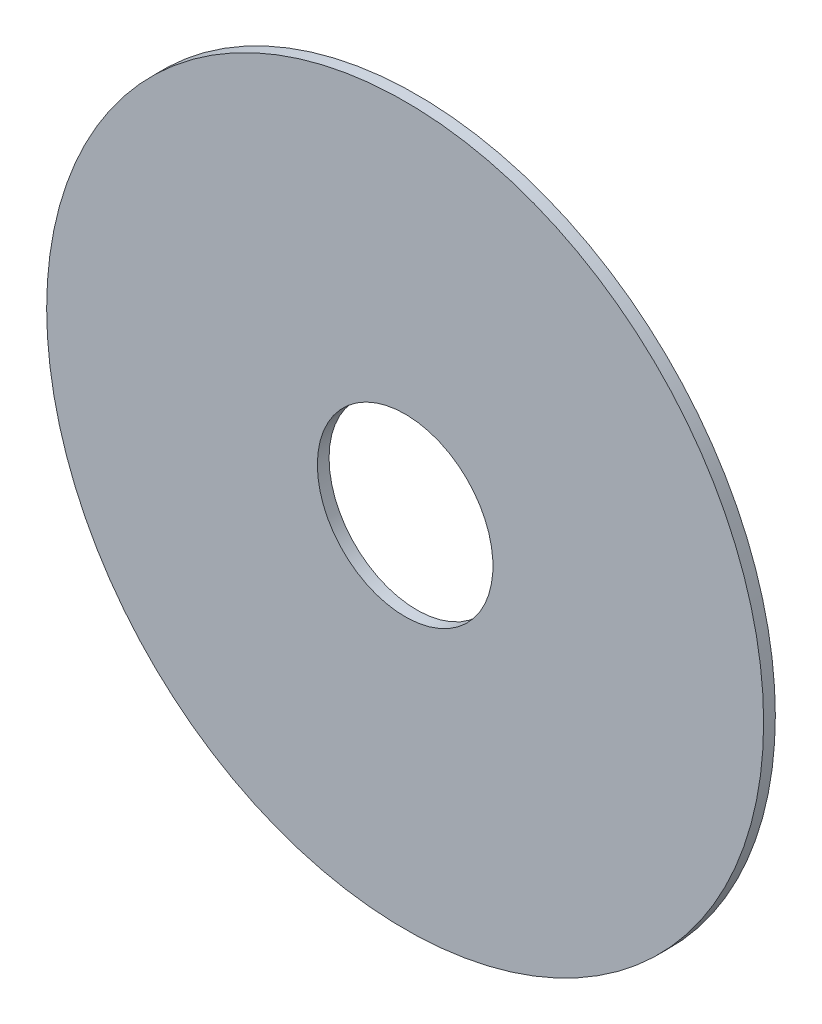
ISO-10303-21;
HEADER;
FILE_DESCRIPTION(('STEP AP214'),'2;1');
FILE_NAME('part.step','',(''),(''),'','','');
FILE_SCHEMA(('AUTOMOTIVE_DESIGN { 1 0 10303 214 1 1 1 1 }'));
ENDSEC;
DATA;
#1=APPLICATION_CONTEXT('core data for automotive mechanical design processes');
#2=APPLICATION_PROTOCOL_DEFINITION('international standard','automotive_design',2000,#1);
#3=PRODUCT_CONTEXT('',#1,'mechanical');
#4=PRODUCT('Part','Part','',(#3));
#5=PRODUCT_RELATED_PRODUCT_CATEGORY('part','',(#4));
#6=PRODUCT_DEFINITION_FORMATION('','',#4);
#7=PRODUCT_DEFINITION_CONTEXT('part definition',#1,'design');
#8=PRODUCT_DEFINITION('design','',#6,#7);
#9=PRODUCT_DEFINITION_SHAPE('','',#8);
#10=(LENGTH_UNIT() NAMED_UNIT(*) SI_UNIT(.MILLI.,.METRE.));
#11=(NAMED_UNIT(*) PLANE_ANGLE_UNIT() SI_UNIT($,.RADIAN.));
#12=(NAMED_UNIT(*) SI_UNIT($,.STERADIAN.) SOLID_ANGLE_UNIT());
#13=UNCERTAINTY_MEASURE_WITH_UNIT(LENGTH_MEASURE(1.E-05),#10,'distance_accuracy_value','');
#14=(GEOMETRIC_REPRESENTATION_CONTEXT(3) GLOBAL_UNCERTAINTY_ASSIGNED_CONTEXT((#13)) GLOBAL_UNIT_ASSIGNED_CONTEXT((#10,
#11,#12)) REPRESENTATION_CONTEXT('',''));
#15=CARTESIAN_POINT('',(0.,0.,0.));
#16=DIRECTION('',(0.,0.,1.));
#17=DIRECTION('',(1.,0.,0.));
#18=AXIS2_PLACEMENT_3D('',#15,#16,#17);
#19=CARTESIAN_POINT('',(0.,0.,0.));
#20=DIRECTION('',(0.,0.,1.));
#21=DIRECTION('',(1.,0.,0.));
#22=AXIS2_PLACEMENT_3D('',#19,#20,#21);
#23=PLANE('',#22);
#24=CARTESIAN_POINT('',(0.,0.,0.));
#25=DIRECTION('',(0.,0.,-1.));
#26=DIRECTION('',(1.,0.,0.));
#27=AXIS2_PLACEMENT_3D('',#24,#25,#26);
#28=CIRCLE('',#27,6.);
#29=CARTESIAN_POINT('',(-6.,0.,0.));
#30=VERTEX_POINT('',#29);
#31=EDGE_CURVE('E45',#30,#30,#28,.T.);
#32=ORIENTED_EDGE('',*,*,#31,.F.);
#33=EDGE_LOOP('',(#32));
#34=FACE_BOUND('',#33,.T.);
#35=CARTESIAN_POINT('',(0.,0.,0.));
#36=DIRECTION('',(0.,0.,1.));
#37=DIRECTION('',(1.,0.,0.));
#38=AXIS2_PLACEMENT_3D('',#35,#36,#37);
#39=CIRCLE('',#38,24.5);
#40=CARTESIAN_POINT('',(-24.5,0.,0.));
#41=VERTEX_POINT('',#40);
#42=EDGE_CURVE('E11',#41,#41,#39,.T.);
#43=ORIENTED_EDGE('',*,*,#42,.F.);
#44=EDGE_LOOP('',(#43));
#45=FACE_BOUND('',#44,.T.);
#46=ADVANCED_FACE('F17',(#34,#45),#23,.F.);
#47=CARTESIAN_POINT('',(0.,0.,0.8));
#48=DIRECTION('',(0.,0.,1.));
#49=DIRECTION('',(1.,0.,0.));
#50=AXIS2_PLACEMENT_3D('',#47,#48,#49);
#51=PLANE('',#50);
#52=CARTESIAN_POINT('',(0.,0.,0.8));
#53=DIRECTION('',(0.,0.,-1.));
#54=DIRECTION('',(1.,0.,0.));
#55=AXIS2_PLACEMENT_3D('',#52,#53,#54);
#56=CIRCLE('',#55,6.);
#57=CARTESIAN_POINT('',(-6.,0.,0.8));
#58=VERTEX_POINT('',#57);
#59=EDGE_CURVE('E52',#58,#58,#56,.T.);
#60=ORIENTED_EDGE('',*,*,#59,.T.);
#61=EDGE_LOOP('',(#60));
#62=FACE_BOUND('',#61,.T.);
#63=CARTESIAN_POINT('',(0.,0.,0.8));
#64=DIRECTION('',(0.,0.,1.));
#65=DIRECTION('',(1.,0.,0.));
#66=AXIS2_PLACEMENT_3D('',#63,#64,#65);
#67=CIRCLE('',#66,24.5);
#68=CARTESIAN_POINT('',(-24.5,0.,0.8));
#69=VERTEX_POINT('',#68);
#70=EDGE_CURVE('E27',#69,#69,#67,.T.);
#71=ORIENTED_EDGE('',*,*,#70,.T.);
#72=EDGE_LOOP('',(#71));
#73=FACE_BOUND('',#72,.T.);
#74=ADVANCED_FACE('F19',(#62,#73),#51,.T.);
#75=CARTESIAN_POINT('',(0.,0.,0.));
#76=DIRECTION('',(0.,0.,1.));
#77=DIRECTION('',(1.,0.,0.));
#78=AXIS2_PLACEMENT_3D('',#75,#76,#77);
#79=CYLINDRICAL_SURFACE('',#78,24.5);
#80=ORIENTED_EDGE('',*,*,#42,.T.);
#81=EDGE_LOOP('',(#80));
#82=FACE_BOUND('',#81,.T.);
#83=ORIENTED_EDGE('',*,*,#70,.F.);
#84=EDGE_LOOP('',(#83));
#85=FACE_BOUND('',#84,.T.);
#86=ADVANCED_FACE('F64',(#82,#85),#79,.T.);
#87=CARTESIAN_POINT('',(0.,0.,0.));
#88=DIRECTION('',(0.,0.,1.));
#89=DIRECTION('',(1.,0.,0.));
#90=AXIS2_PLACEMENT_3D('',#87,#88,#89);
#91=CYLINDRICAL_SURFACE('',#90,6.);
#92=ORIENTED_EDGE('',*,*,#31,.T.);
#93=EDGE_LOOP('',(#92));
#94=FACE_BOUND('',#93,.T.);
#95=ORIENTED_EDGE('',*,*,#59,.F.);
#96=EDGE_LOOP('',(#95));
#97=FACE_BOUND('',#96,.T.);
#98=ADVANCED_FACE('F66',(#94,#97),#91,.F.);
#99=CLOSED_SHELL('',(#46,#74,#86,#98));
#100=MANIFOLD_SOLID_BREP('B1',#99);
#101=ADVANCED_BREP_SHAPE_REPRESENTATION('',(#18,#100),#14);
#102=SHAPE_DEFINITION_REPRESENTATION(#9,#101);
ENDSEC;
END-ISO-10303-21;
